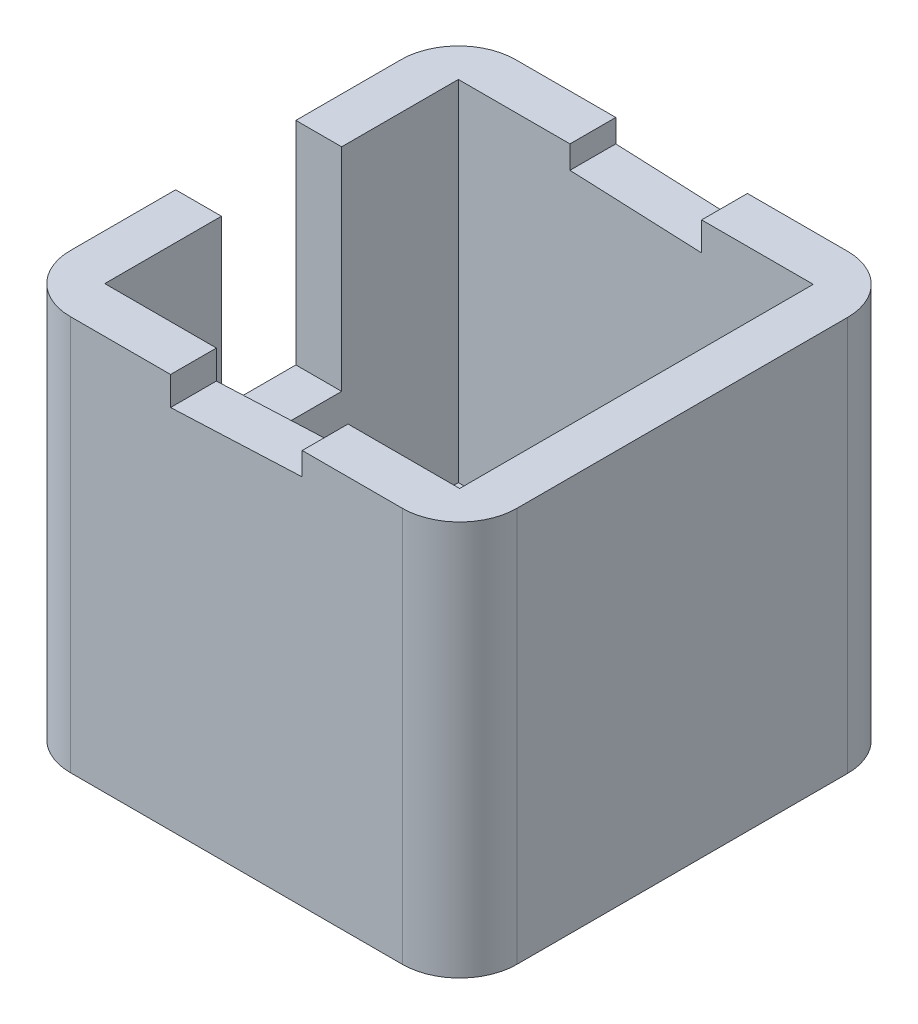
ISO-10303-21;
HEADER;
FILE_DESCRIPTION(('STEP AP214'),'2;1');
FILE_NAME('part.step','',(''),(''),'','','');
FILE_SCHEMA(('AUTOMOTIVE_DESIGN { 1 0 10303 214 1 1 1 1 }'));
ENDSEC;
DATA;
#1=APPLICATION_CONTEXT('core data for automotive mechanical design processes');
#2=APPLICATION_PROTOCOL_DEFINITION('international standard','automotive_design',2000,#1);
#3=PRODUCT_CONTEXT('',#1,'mechanical');
#4=PRODUCT('Part','Part','',(#3));
#5=PRODUCT_RELATED_PRODUCT_CATEGORY('part','',(#4));
#6=PRODUCT_DEFINITION_FORMATION('','',#4);
#7=PRODUCT_DEFINITION_CONTEXT('part definition',#1,'design');
#8=PRODUCT_DEFINITION('design','',#6,#7);
#9=PRODUCT_DEFINITION_SHAPE('','',#8);
#10=(LENGTH_UNIT() NAMED_UNIT(*) SI_UNIT(.MILLI.,.METRE.));
#11=(NAMED_UNIT(*) PLANE_ANGLE_UNIT() SI_UNIT($,.RADIAN.));
#12=(NAMED_UNIT(*) SI_UNIT($,.STERADIAN.) SOLID_ANGLE_UNIT());
#13=UNCERTAINTY_MEASURE_WITH_UNIT(LENGTH_MEASURE(1.E-05),#10,'distance_accuracy_value','');
#14=(GEOMETRIC_REPRESENTATION_CONTEXT(3) GLOBAL_UNCERTAINTY_ASSIGNED_CONTEXT((#13)) GLOBAL_UNIT_ASSIGNED_CONTEXT((#10,
#11,#12)) REPRESENTATION_CONTEXT('',''));
#15=CARTESIAN_POINT('',(0.,0.,0.));
#16=DIRECTION('',(0.,0.,1.));
#17=DIRECTION('',(1.,0.,0.));
#18=AXIS2_PLACEMENT_3D('',#15,#16,#17);
#19=CARTESIAN_POINT('',(0.,69.,0.));
#20=DIRECTION('',(0.,1.,0.));
#21=DIRECTION('',(0.,0.,1.));
#22=AXIS2_PLACEMENT_3D('',#19,#20,#21);
#23=PLANE('',#22);
#24=DIRECTION('',(-1.,0.,0.));
#25=VECTOR('',#24,1.);
#26=CARTESIAN_POINT('',(2.00000000000001,69.,-20.3852522355587));
#27=LINE('',#26,#25);
#28=CARTESIAN_POINT('',(0.,69.,-20.3852522355587));
#29=VERTEX_POINT('',#28);
#30=CARTESIAN_POINT('',(-7.99999999999999,69.,-20.3852522355587));
#31=VERTEX_POINT('',#30);
#32=EDGE_CURVE('E363',#29,#31,#27,.T.);
#33=ORIENTED_EDGE('',*,*,#32,.T.);
#34=DIRECTION('',(0.,0.,-1.));
#35=VECTOR('',#34,1.);
#36=CARTESIAN_POINT('',(-8.,69.,8.));
#37=LINE('',#36,#35);
#38=CARTESIAN_POINT('',(-8.,69.,-2.));
#39=VERTEX_POINT('',#38);
#40=EDGE_CURVE('E272',#39,#31,#37,.T.);
#41=ORIENTED_EDGE('',*,*,#40,.F.);
#42=CARTESIAN_POINT('',(2.,69.,-2.));
#43=DIRECTION('',(0.,1.,0.));
#44=DIRECTION('',(0.,0.,1.));
#45=AXIS2_PLACEMENT_3D('',#42,#43,#44);
#46=CIRCLE('',#45,10.);
#47=CARTESIAN_POINT('',(2.,69.,8.));
#48=VERTEX_POINT('',#47);
#49=EDGE_CURVE('E337',#39,#48,#46,.T.);
#50=ORIENTED_EDGE('',*,*,#49,.T.);
#51=DIRECTION('',(1.,0.,0.));
#52=VECTOR('',#51,1.);
#53=CARTESIAN_POINT('',(-8.,69.,8.));
#54=LINE('',#53,#52);
#55=CARTESIAN_POINT('',(19.5,69.,8.));
#56=VERTEX_POINT('',#55);
#57=EDGE_CURVE('E481',#48,#56,#54,.T.);
#58=ORIENTED_EDGE('',*,*,#57,.T.);
#59=DIRECTION('',(0.,0.,1.));
#60=VECTOR('',#59,1.);
#61=CARTESIAN_POINT('',(19.5,69.,0.));
#62=LINE('',#61,#60);
#63=CARTESIAN_POINT('',(19.5,69.,0.));
#64=VERTEX_POINT('',#63);
#65=EDGE_CURVE('E379',#64,#56,#62,.T.);
#66=ORIENTED_EDGE('',*,*,#65,.F.);
#67=DIRECTION('',(1.,0.,0.));
#68=VECTOR('',#67,1.);
#69=CARTESIAN_POINT('',(0.,69.,0.));
#70=LINE('',#69,#68);
#71=CARTESIAN_POINT('',(0.,69.,0.));
#72=VERTEX_POINT('',#71);
#73=EDGE_CURVE('E467',#72,#64,#70,.T.);
#74=ORIENTED_EDGE('',*,*,#73,.F.);
#75=DIRECTION('',(0.,0.,-1.));
#76=VECTOR('',#75,1.);
#77=CARTESIAN_POINT('',(0.,69.,0.));
#78=LINE('',#77,#76);
#79=EDGE_CURVE('E457',#72,#29,#78,.T.);
#80=ORIENTED_EDGE('',*,*,#79,.T.);
#81=EDGE_LOOP('',(#33,#41,#50,#58,#66,#74,#80));
#82=FACE_BOUND('',#81,.T.);
#83=ADVANCED_FACE('F87',(#82),#23,.T.);
#84=DIRECTION('',(0.,0.,1.));
#85=VECTOR('',#84,1.);
#86=CARTESIAN_POINT('',(42.5,69.,0.));
#87=LINE('',#86,#85);
#88=CARTESIAN_POINT('',(42.5,69.,0.));
#89=VERTEX_POINT('',#88);
#90=CARTESIAN_POINT('',(42.5,69.,8.));
#91=VERTEX_POINT('',#90);
#92=EDGE_CURVE('E386',#89,#91,#87,.T.);
#93=ORIENTED_EDGE('',*,*,#92,.T.);
#94=CARTESIAN_POINT('',(60.,69.,8.));
#95=VERTEX_POINT('',#94);
#96=EDGE_CURVE('E295',#91,#95,#54,.T.);
#97=ORIENTED_EDGE('',*,*,#96,.T.);
#98=CARTESIAN_POINT('',(60.,69.,-2.));
#99=DIRECTION('',(0.,1.,0.));
#100=DIRECTION('',(0.,0.,1.));
#101=AXIS2_PLACEMENT_3D('',#98,#99,#100);
#102=CIRCLE('',#101,10.);
#103=CARTESIAN_POINT('',(70.,69.,-2.));
#104=VERTEX_POINT('',#103);
#105=EDGE_CURVE('E335',#95,#104,#102,.T.);
#106=ORIENTED_EDGE('',*,*,#105,.T.);
#107=DIRECTION('',(0.,0.,-1.));
#108=VECTOR('',#107,1.);
#109=CARTESIAN_POINT('',(70.,69.,8.));
#110=LINE('',#109,#108);
#111=CARTESIAN_POINT('',(70.,69.,-59.7705044711174));
#112=VERTEX_POINT('',#111);
#113=EDGE_CURVE('E483',#104,#112,#110,.T.);
#114=ORIENTED_EDGE('',*,*,#113,.T.);
#115=CARTESIAN_POINT('',(60.,69.,-59.7705044711174));
#116=DIRECTION('',(0.,1.,0.));
#117=DIRECTION('',(0.,0.,1.));
#118=AXIS2_PLACEMENT_3D('',#115,#116,#117);
#119=CIRCLE('',#118,10.);
#120=CARTESIAN_POINT('',(60.,69.,-69.7705044711174));
#121=VERTEX_POINT('',#120);
#122=EDGE_CURVE('E340',#112,#121,#119,.T.);
#123=ORIENTED_EDGE('',*,*,#122,.T.);
#124=DIRECTION('',(1.,0.,0.));
#125=VECTOR('',#124,1.);
#126=CARTESIAN_POINT('',(-7.99999999999998,69.,-69.7705044711174));
#127=LINE('',#126,#125);
#128=CARTESIAN_POINT('',(42.5,69.,-69.7705044711174));
#129=VERTEX_POINT('',#128);
#130=EDGE_CURVE('E278',#129,#121,#127,.T.);
#131=ORIENTED_EDGE('',*,*,#130,.F.);
#132=DIRECTION('',(0.,0.,-1.));
#133=VECTOR('',#132,1.);
#134=CARTESIAN_POINT('',(42.5,69.,-61.7705044711174));
#135=LINE('',#134,#133);
#136=CARTESIAN_POINT('',(42.5,69.,-61.7705044711174));
#137=VERTEX_POINT('',#136);
#138=EDGE_CURVE('E405',#137,#129,#135,.T.);
#139=ORIENTED_EDGE('',*,*,#138,.F.);
#140=DIRECTION('',(1.,0.,0.));
#141=VECTOR('',#140,1.);
#142=CARTESIAN_POINT('',(0.,69.,-61.7705044711174));
#143=LINE('',#142,#141);
#144=CARTESIAN_POINT('',(62.,69.,-61.7705044711174));
#145=VERTEX_POINT('',#144);
#146=EDGE_CURVE('E459',#137,#145,#143,.T.);
#147=ORIENTED_EDGE('',*,*,#146,.T.);
#148=DIRECTION('',(0.,0.,-1.));
#149=VECTOR('',#148,1.);
#150=CARTESIAN_POINT('',(62.,69.,0.));
#151=LINE('',#150,#149);
#152=CARTESIAN_POINT('',(62.,69.,0.));
#153=VERTEX_POINT('',#152);
#154=EDGE_CURVE('E463',#153,#145,#151,.T.);
#155=ORIENTED_EDGE('',*,*,#154,.F.);
#156=EDGE_CURVE('E466',#89,#153,#70,.T.);
#157=ORIENTED_EDGE('',*,*,#156,.F.);
#158=EDGE_LOOP('',(#93,#97,#106,#114,#123,#131,#139,#147,#155,#157));
#159=FACE_BOUND('',#158,.T.);
#160=ADVANCED_FACE('F497',(#159),#23,.T.);
#161=CARTESIAN_POINT('',(56.3431457505076,56.,-56.1136502216251));
#162=DIRECTION('',(0.,-1.,0.));
#163=DIRECTION('',(0.,0.,-1.));
#164=AXIS2_PLACEMENT_3D('',#161,#162,#163);
#165=CYLINDRICAL_SURFACE('',#164,4.);
#166=CARTESIAN_POINT('',(56.3431457505076,8.,-56.1136502216251));
#167=DIRECTION('',(0.,1.,0.));
#168=DIRECTION('',(0.,0.,1.));
#169=AXIS2_PLACEMENT_3D('',#166,#167,#168);
#170=CIRCLE('',#169,4.);
#171=CARTESIAN_POINT('',(56.3431457505076,8.,-52.1136502216251));
#172=VERTEX_POINT('',#171);
#173=EDGE_CURVE('E450',#172,#172,#170,.T.);
#174=ORIENTED_EDGE('',*,*,#173,.T.);
#175=EDGE_LOOP('',(#174));
#176=FACE_BOUND('',#175,.T.);
#177=CARTESIAN_POINT('',(56.3431457505076,4.,-56.1136502216251));
#178=DIRECTION('',(0.,-1.,0.));
#179=DIRECTION('',(0.,0.,-1.));
#180=AXIS2_PLACEMENT_3D('',#177,#178,#179);
#181=CIRCLE('',#180,4.);
#182=CARTESIAN_POINT('',(56.3431457505076,4.,-60.1136502216251));
#183=VERTEX_POINT('',#182);
#184=EDGE_CURVE('E314',#183,#183,#181,.F.);
#185=ORIENTED_EDGE('',*,*,#184,.F.);
#186=EDGE_LOOP('',(#185));
#187=FACE_BOUND('',#186,.T.);
#188=ADVANCED_FACE('F575',(#176,#187),#165,.F.);
#189=CARTESIAN_POINT('',(5.65685424949236,56.,-5.65685424949237));
#190=DIRECTION('',(0.,-1.,0.));
#191=DIRECTION('',(0.,0.,-1.));
#192=AXIS2_PLACEMENT_3D('',#189,#190,#191);
#193=CYLINDRICAL_SURFACE('',#192,4.);
#194=CARTESIAN_POINT('',(5.65685424949236,8.,-5.65685424949237));
#195=DIRECTION('',(0.,1.,0.));
#196=DIRECTION('',(0.,0.,1.));
#197=AXIS2_PLACEMENT_3D('',#194,#195,#196);
#198=CIRCLE('',#197,4.);
#199=CARTESIAN_POINT('',(5.65685424949236,8.,-1.65685424949236));
#200=VERTEX_POINT('',#199);
#201=EDGE_CURVE('E442',#200,#200,#198,.T.);
#202=ORIENTED_EDGE('',*,*,#201,.T.);
#203=EDGE_LOOP('',(#202));
#204=FACE_BOUND('',#203,.T.);
#205=CARTESIAN_POINT('',(5.65685424949236,4.,-5.65685424949237));
#206=DIRECTION('',(0.,-1.,0.));
#207=DIRECTION('',(0.,0.,-1.));
#208=AXIS2_PLACEMENT_3D('',#205,#206,#207);
#209=CIRCLE('',#208,4.);
#210=CARTESIAN_POINT('',(5.65685424949236,4.,-9.65685424949237));
#211=VERTEX_POINT('',#210);
#212=EDGE_CURVE('E308',#211,#211,#209,.F.);
#213=ORIENTED_EDGE('',*,*,#212,.F.);
#214=EDGE_LOOP('',(#213));
#215=FACE_BOUND('',#214,.T.);
#216=ADVANCED_FACE('F595',(#204,#215),#193,.F.);
#217=CARTESIAN_POINT('',(0.,8.,0.));
#218=DIRECTION('',(0.,1.,0.));
#219=DIRECTION('',(0.,0.,1.));
#220=AXIS2_PLACEMENT_3D('',#217,#218,#219);
#221=PLANE('',#220);
#222=CARTESIAN_POINT('',(56.3431457505076,8.,-5.65685424949237));
#223=DIRECTION('',(0.,1.,0.));
#224=DIRECTION('',(0.,0.,1.));
#225=AXIS2_PLACEMENT_3D('',#222,#223,#224);
#226=CIRCLE('',#225,4.);
#227=CARTESIAN_POINT('',(56.3431457505076,8.,-1.65685424949237));
#228=VERTEX_POINT('',#227);
#229=EDGE_CURVE('E447',#228,#228,#226,.F.);
#230=ORIENTED_EDGE('',*,*,#229,.T.);
#231=EDGE_LOOP('',(#230));
#232=FACE_BOUND('',#231,.T.);
#233=ORIENTED_EDGE('',*,*,#201,.F.);
#234=EDGE_LOOP('',(#233));
#235=FACE_BOUND('',#234,.T.);
#236=DIRECTION('',(1.,0.,0.));
#237=VECTOR('',#236,1.);
#238=CARTESIAN_POINT('',(0.,8.,0.));
#239=LINE('',#238,#237);
#240=CARTESIAN_POINT('',(0.,8.,0.));
#241=VERTEX_POINT('',#240);
#242=CARTESIAN_POINT('',(62.,8.,0.));
#243=VERTEX_POINT('',#242);
#244=EDGE_CURVE('E276',#241,#243,#239,.T.);
#245=ORIENTED_EDGE('',*,*,#244,.T.);
#246=DIRECTION('',(0.,0.,-1.));
#247=VECTOR('',#246,1.);
#248=CARTESIAN_POINT('',(62.,8.,0.));
#249=LINE('',#248,#247);
#250=CARTESIAN_POINT('',(62.,8.,-61.7705044711174));
#251=VERTEX_POINT('',#250);
#252=EDGE_CURVE('E297',#243,#251,#249,.T.);
#253=ORIENTED_EDGE('',*,*,#252,.T.);
#254=DIRECTION('',(1.,0.,0.));
#255=VECTOR('',#254,1.);
#256=CARTESIAN_POINT('',(0.,8.,-61.7705044711174));
#257=LINE('',#256,#255);
#258=CARTESIAN_POINT('',(0.,8.,-61.7705044711174));
#259=VERTEX_POINT('',#258);
#260=EDGE_CURVE('E299',#259,#251,#257,.T.);
#261=ORIENTED_EDGE('',*,*,#260,.F.);
#262=DIRECTION('',(0.,0.,-1.));
#263=VECTOR('',#262,1.);
#264=CARTESIAN_POINT('',(0.,8.,0.));
#265=LINE('',#264,#263);
#266=EDGE_CURVE('E302',#241,#259,#265,.T.);
#267=ORIENTED_EDGE('',*,*,#266,.F.);
#268=EDGE_LOOP('',(#245,#253,#261,#267));
#269=FACE_BOUND('',#268,.T.);
#270=ORIENTED_EDGE('',*,*,#173,.F.);
#271=EDGE_LOOP('',(#270));
#272=FACE_BOUND('',#271,.T.);
#273=CARTESIAN_POINT('',(5.65685424949236,8.,-56.1136502216251));
#274=DIRECTION('',(0.,1.,0.));
#275=DIRECTION('',(0.,0.,1.));
#276=AXIS2_PLACEMENT_3D('',#273,#274,#275);
#277=CIRCLE('',#276,4.);
#278=CARTESIAN_POINT('',(5.65685424949236,8.,-52.1136502216251));
#279=VERTEX_POINT('',#278);
#280=EDGE_CURVE('E453',#279,#279,#277,.F.);
#281=ORIENTED_EDGE('',*,*,#280,.T.);
#282=EDGE_LOOP('',(#281));
#283=FACE_BOUND('',#282,.T.);
#284=ADVANCED_FACE('F592',(#232,#235,#269,#272,#283),#221,.T.);
#285=CARTESIAN_POINT('',(0.,0.,0.));
#286=DIRECTION('',(0.,1.,0.));
#287=DIRECTION('',(0.,0.,1.));
#288=AXIS2_PLACEMENT_3D('',#285,#286,#287);
#289=PLANE('',#288);
#290=DIRECTION('',(1.,0.,0.));
#291=VECTOR('',#290,1.);
#292=CARTESIAN_POINT('',(-7.99999999999998,0.,-69.7705044711174));
#293=LINE('',#292,#291);
#294=CARTESIAN_POINT('',(2.00000000000002,0.,-69.7705044711174));
#295=VERTEX_POINT('',#294);
#296=CARTESIAN_POINT('',(60.,0.,-69.7705044711174));
#297=VERTEX_POINT('',#296);
#298=EDGE_CURVE('E289',#295,#297,#293,.T.);
#299=ORIENTED_EDGE('',*,*,#298,.T.);
#300=CARTESIAN_POINT('',(60.,0.,-59.7705044711174));
#301=DIRECTION('',(0.,1.,0.));
#302=DIRECTION('',(0.,0.,1.));
#303=AXIS2_PLACEMENT_3D('',#300,#301,#302);
#304=CIRCLE('',#303,10.);
#305=CARTESIAN_POINT('',(70.,0.,-59.7705044711174));
#306=VERTEX_POINT('',#305);
#307=EDGE_CURVE('E328',#297,#306,#304,.F.);
#308=ORIENTED_EDGE('',*,*,#307,.T.);
#309=DIRECTION('',(0.,0.,-1.));
#310=VECTOR('',#309,1.);
#311=CARTESIAN_POINT('',(70.,0.,8.));
#312=LINE('',#311,#310);
#313=CARTESIAN_POINT('',(70.,0.,-2.));
#314=VERTEX_POINT('',#313);
#315=EDGE_CURVE('E285',#314,#306,#312,.T.);
#316=ORIENTED_EDGE('',*,*,#315,.F.);
#317=CARTESIAN_POINT('',(60.,0.,-2.));
#318=DIRECTION('',(0.,1.,0.));
#319=DIRECTION('',(0.,0.,1.));
#320=AXIS2_PLACEMENT_3D('',#317,#318,#319);
#321=CIRCLE('',#320,10.);
#322=CARTESIAN_POINT('',(60.,0.,8.));
#323=VERTEX_POINT('',#322);
#324=EDGE_CURVE('E322',#314,#323,#321,.F.);
#325=ORIENTED_EDGE('',*,*,#324,.T.);
#326=DIRECTION('',(1.,0.,0.));
#327=VECTOR('',#326,1.);
#328=CARTESIAN_POINT('',(-8.,0.,8.));
#329=LINE('',#328,#327);
#330=CARTESIAN_POINT('',(2.,0.,8.));
#331=VERTEX_POINT('',#330);
#332=EDGE_CURVE('E282',#331,#323,#329,.T.);
#333=ORIENTED_EDGE('',*,*,#332,.F.);
#334=CARTESIAN_POINT('',(2.,0.,-2.));
#335=DIRECTION('',(0.,1.,0.));
#336=DIRECTION('',(0.,0.,1.));
#337=AXIS2_PLACEMENT_3D('',#334,#335,#336);
#338=CIRCLE('',#337,10.);
#339=CARTESIAN_POINT('',(-8.,0.,-2.));
#340=VERTEX_POINT('',#339);
#341=EDGE_CURVE('E324',#331,#340,#338,.F.);
#342=ORIENTED_EDGE('',*,*,#341,.T.);
#343=DIRECTION('',(0.,0.,-1.));
#344=VECTOR('',#343,1.);
#345=CARTESIAN_POINT('',(-8.,0.,8.));
#346=LINE('',#345,#344);
#347=CARTESIAN_POINT('',(-7.99999999999998,0.,-59.7705044711174));
#348=VERTEX_POINT('',#347);
#349=EDGE_CURVE('E292',#340,#348,#346,.T.);
#350=ORIENTED_EDGE('',*,*,#349,.T.);
#351=CARTESIAN_POINT('',(2.00000000000002,0.,-59.7705044711174));
#352=DIRECTION('',(0.,1.,0.));
#353=DIRECTION('',(0.,0.,1.));
#354=AXIS2_PLACEMENT_3D('',#351,#352,#353);
#355=CIRCLE('',#354,10.);
#356=EDGE_CURVE('E326',#348,#295,#355,.F.);
#357=ORIENTED_EDGE('',*,*,#356,.T.);
#358=EDGE_LOOP('',(#299,#308,#316,#325,#333,#342,#350,#357));
#359=FACE_BOUND('',#358,.T.);
#360=CARTESIAN_POINT('',(56.3431457505076,0.,-5.65685424949237));
#361=DIRECTION('',(0.,1.,0.));
#362=DIRECTION('',(0.,0.,1.));
#363=AXIS2_PLACEMENT_3D('',#360,#361,#362);
#364=CIRCLE('',#363,2.);
#365=CARTESIAN_POINT('',(56.3431457505076,0.,-3.65685424949237));
#366=VERTEX_POINT('',#365);
#367=EDGE_CURVE('E436',#366,#366,#364,.T.);
#368=ORIENTED_EDGE('',*,*,#367,.T.);
#369=EDGE_LOOP('',(#368));
#370=FACE_BOUND('',#369,.T.);
#371=CARTESIAN_POINT('',(5.65685424949236,0.,-5.65685424949237));
#372=DIRECTION('',(0.,-1.,0.));
#373=DIRECTION('',(0.,0.,-1.));
#374=AXIS2_PLACEMENT_3D('',#371,#372,#373);
#375=CIRCLE('',#374,2.);
#376=CARTESIAN_POINT('',(5.65685424949236,0.,-7.65685424949237));
#377=VERTEX_POINT('',#376);
#378=EDGE_CURVE('E433',#377,#377,#375,.T.);
#379=ORIENTED_EDGE('',*,*,#378,.F.);
#380=EDGE_LOOP('',(#379));
#381=FACE_BOUND('',#380,.T.);
#382=CARTESIAN_POINT('',(5.65685424949236,0.,-56.1136502216251));
#383=DIRECTION('',(0.,1.,0.));
#384=DIRECTION('',(0.,0.,1.));
#385=AXIS2_PLACEMENT_3D('',#382,#383,#384);
#386=CIRCLE('',#385,2.);
#387=CARTESIAN_POINT('',(5.65685424949236,0.,-54.1136502216251));
#388=VERTEX_POINT('',#387);
#389=EDGE_CURVE('E427',#388,#388,#386,.T.);
#390=ORIENTED_EDGE('',*,*,#389,.T.);
#391=EDGE_LOOP('',(#390));
#392=FACE_BOUND('',#391,.T.);
#393=CARTESIAN_POINT('',(56.3431457505076,0.,-56.1136502216251));
#394=DIRECTION('',(0.,-1.,0.));
#395=DIRECTION('',(0.,0.,-1.));
#396=AXIS2_PLACEMENT_3D('',#393,#394,#395);
#397=CIRCLE('',#396,2.);
#398=CARTESIAN_POINT('',(56.3431457505076,0.,-58.1136502216251));
#399=VERTEX_POINT('',#398);
#400=EDGE_CURVE('E421',#399,#399,#397,.T.);
#401=ORIENTED_EDGE('',*,*,#400,.F.);
#402=EDGE_LOOP('',(#401));
#403=FACE_BOUND('',#402,.T.);
#404=ADVANCED_FACE('F503',(#359,#370,#381,#392,#403),#289,.F.);
#405=CARTESIAN_POINT('',(-8.,69.,8.));
#406=DIRECTION('',(0.,0.,-1.));
#407=DIRECTION('',(-1.,0.,0.));
#408=AXIS2_PLACEMENT_3D('',#405,#406,#407);
#409=PLANE('',#408);
#410=ORIENTED_EDGE('',*,*,#96,.F.);
#411=DIRECTION('',(0.,1.,0.));
#412=VECTOR('',#411,1.);
#413=CARTESIAN_POINT('',(42.5,65.,8.));
#414=LINE('',#413,#412);
#415=CARTESIAN_POINT('',(42.5,65.,8.));
#416=VERTEX_POINT('',#415);
#417=EDGE_CURVE('E374',#416,#91,#414,.T.);
#418=ORIENTED_EDGE('',*,*,#417,.F.);
#419=DIRECTION('',(0.999056158355059,0.043437224276307,0.));
#420=VECTOR('',#419,1.);
#421=CARTESIAN_POINT('',(19.5,64.,8.));
#422=LINE('',#421,#420);
#423=CARTESIAN_POINT('',(19.5,64.,8.));
#424=VERTEX_POINT('',#423);
#425=EDGE_CURVE('E382',#424,#416,#422,.T.);
#426=ORIENTED_EDGE('',*,*,#425,.F.);
#427=DIRECTION('',(0.,-1.,0.));
#428=VECTOR('',#427,1.);
#429=CARTESIAN_POINT('',(19.5,69.,8.));
#430=LINE('',#429,#428);
#431=EDGE_CURVE('E366',#56,#424,#430,.T.);
#432=ORIENTED_EDGE('',*,*,#431,.F.);
#433=ORIENTED_EDGE('',*,*,#57,.F.);
#434=DIRECTION('',(0.,-1.,0.));
#435=VECTOR('',#434,1.);
#436=CARTESIAN_POINT('',(2.,0.,8.));
#437=LINE('',#436,#435);
#438=EDGE_CURVE('E350',#48,#331,#437,.T.);
#439=ORIENTED_EDGE('',*,*,#438,.T.);
#440=ORIENTED_EDGE('',*,*,#332,.T.);
#441=DIRECTION('',(0.,-1.,0.));
#442=VECTOR('',#441,1.);
#443=CARTESIAN_POINT('',(60.,69.,8.));
#444=LINE('',#443,#442);
#445=EDGE_CURVE('E347',#323,#95,#444,.F.);
#446=ORIENTED_EDGE('',*,*,#445,.T.);
#447=EDGE_LOOP('',(#410,#418,#426,#432,#433,#439,#440,#446));
#448=FACE_BOUND('',#447,.T.);
#449=ADVANCED_FACE('F514',(#448),#409,.F.);
#450=CARTESIAN_POINT('',(70.,69.,8.));
#451=DIRECTION('',(-1.,0.,0.));
#452=DIRECTION('',(0.,0.,1.));
#453=AXIS2_PLACEMENT_3D('',#450,#451,#452);
#454=PLANE('',#453);
#455=ORIENTED_EDGE('',*,*,#315,.T.);
#456=DIRECTION('',(0.,-1.,0.));
#457=VECTOR('',#456,1.);
#458=CARTESIAN_POINT('',(70.,69.,-59.7705044711174));
#459=LINE('',#458,#457);
#460=EDGE_CURVE('E333',#306,#112,#459,.F.);
#461=ORIENTED_EDGE('',*,*,#460,.T.);
#462=ORIENTED_EDGE('',*,*,#113,.F.);
#463=DIRECTION('',(0.,-1.,0.));
#464=VECTOR('',#463,1.);
#465=CARTESIAN_POINT('',(70.,69.,-2.));
#466=LINE('',#465,#464);
#467=EDGE_CURVE('E330',#104,#314,#466,.T.);
#468=ORIENTED_EDGE('',*,*,#467,.T.);
#469=EDGE_LOOP('',(#455,#461,#462,#468));
#470=FACE_BOUND('',#469,.T.);
#471=ADVANCED_FACE('F506',(#470),#454,.F.);
#472=CARTESIAN_POINT('',(-7.99999999999998,69.,-69.7705044711174));
#473=DIRECTION('',(0.,0.,-1.));
#474=DIRECTION('',(-1.,0.,0.));
#475=AXIS2_PLACEMENT_3D('',#472,#473,#474);
#476=PLANE('',#475);
#477=DIRECTION('',(0.,1.,0.));
#478=VECTOR('',#477,1.);
#479=CARTESIAN_POINT('',(19.5,65.,-69.7705044711174));
#480=LINE('',#479,#478);
#481=CARTESIAN_POINT('',(19.5,65.,-69.7705044711174));
#482=VERTEX_POINT('',#481);
#483=CARTESIAN_POINT('',(19.5,69.,-69.7705044711174));
#484=VERTEX_POINT('',#483);
#485=EDGE_CURVE('E399',#482,#484,#480,.T.);
#486=ORIENTED_EDGE('',*,*,#485,.F.);
#487=DIRECTION('',(-0.999056158355059,0.043437224276307,0.));
#488=VECTOR('',#487,1.);
#489=CARTESIAN_POINT('',(42.5,64.,-69.7705044711174));
#490=LINE('',#489,#488);
#491=CARTESIAN_POINT('',(42.5,64.,-69.7705044711174));
#492=VERTEX_POINT('',#491);
#493=EDGE_CURVE('E408',#492,#482,#490,.T.);
#494=ORIENTED_EDGE('',*,*,#493,.F.);
#495=DIRECTION('',(0.,-1.,0.));
#496=VECTOR('',#495,1.);
#497=CARTESIAN_POINT('',(42.5,69.,-69.7705044711174));
#498=LINE('',#497,#496);
#499=EDGE_CURVE('E389',#129,#492,#498,.T.);
#500=ORIENTED_EDGE('',*,*,#499,.F.);
#501=ORIENTED_EDGE('',*,*,#130,.T.);
#502=DIRECTION('',(0.,-1.,0.));
#503=VECTOR('',#502,1.);
#504=CARTESIAN_POINT('',(60.,0.,-69.7705044711174));
#505=LINE('',#504,#503);
#506=EDGE_CURVE('E319',#121,#297,#505,.T.);
#507=ORIENTED_EDGE('',*,*,#506,.T.);
#508=ORIENTED_EDGE('',*,*,#298,.F.);
#509=DIRECTION('',(0.,-1.,0.));
#510=VECTOR('',#509,1.);
#511=CARTESIAN_POINT('',(2.00000000000002,69.,-69.7705044711174));
#512=LINE('',#511,#510);
#513=CARTESIAN_POINT('',(2.00000000000002,69.,-69.7705044711174));
#514=VERTEX_POINT('',#513);
#515=EDGE_CURVE('E317',#295,#514,#512,.F.);
#516=ORIENTED_EDGE('',*,*,#515,.T.);
#517=EDGE_CURVE('E273',#514,#484,#127,.T.);
#518=ORIENTED_EDGE('',*,*,#517,.T.);
#519=EDGE_LOOP('',(#486,#494,#500,#501,#507,#508,#516,#518));
#520=FACE_BOUND('',#519,.T.);
#521=ADVANCED_FACE('F492',(#520),#476,.T.);
#522=CARTESIAN_POINT('',(-8.,69.,8.));
#523=DIRECTION('',(-1.,0.,0.));
#524=DIRECTION('',(0.,0.,1.));
#525=AXIS2_PLACEMENT_3D('',#522,#523,#524);
#526=PLANE('',#525);
#527=DIRECTION('',(0.,1.,0.));
#528=VECTOR('',#527,1.);
#529=CARTESIAN_POINT('',(-7.99999999999999,32.,-20.3852522355587));
#530=LINE('',#529,#528);
#531=CARTESIAN_POINT('',(-7.99999999999999,32.,-20.3852522355587));
#532=VERTEX_POINT('',#531);
#533=EDGE_CURVE('E256',#532,#31,#530,.T.);
#534=ORIENTED_EDGE('',*,*,#533,.F.);
#535=DIRECTION('',(0.,0.,1.));
#536=VECTOR('',#535,1.);
#537=CARTESIAN_POINT('',(-7.99999999999999,32.,-41.3852522355587));
#538=LINE('',#537,#536);
#539=CARTESIAN_POINT('',(-7.99999999999999,32.,-41.3852522355587));
#540=VERTEX_POINT('',#539);
#541=EDGE_CURVE('E265',#540,#532,#538,.T.);
#542=ORIENTED_EDGE('',*,*,#541,.F.);
#543=DIRECTION('',(0.,-1.,0.));
#544=VECTOR('',#543,1.);
#545=CARTESIAN_POINT('',(-7.99999999999999,69.,-41.3852522355587));
#546=LINE('',#545,#544);
#547=CARTESIAN_POINT('',(-7.99999999999999,69.,-41.3852522355587));
#548=VERTEX_POINT('',#547);
#549=EDGE_CURVE('E249',#548,#540,#546,.T.);
#550=ORIENTED_EDGE('',*,*,#549,.F.);
#551=CARTESIAN_POINT('',(-7.99999999999998,69.,-59.7705044711174));
#552=VERTEX_POINT('',#551);
#553=EDGE_CURVE('E262',#548,#552,#37,.T.);
#554=ORIENTED_EDGE('',*,*,#553,.T.);
#555=DIRECTION('',(0.,-1.,0.));
#556=VECTOR('',#555,1.);
#557=CARTESIAN_POINT('',(-7.99999999999998,69.,-59.7705044711174));
#558=LINE('',#557,#556);
#559=EDGE_CURVE('E345',#552,#348,#558,.T.);
#560=ORIENTED_EDGE('',*,*,#559,.T.);
#561=ORIENTED_EDGE('',*,*,#349,.F.);
#562=DIRECTION('',(0.,-1.,0.));
#563=VECTOR('',#562,1.);
#564=CARTESIAN_POINT('',(-8.,69.,-2.));
#565=LINE('',#564,#563);
#566=EDGE_CURVE('E343',#340,#39,#565,.F.);
#567=ORIENTED_EDGE('',*,*,#566,.T.);
#568=ORIENTED_EDGE('',*,*,#40,.T.);
#569=EDGE_LOOP('',(#534,#542,#550,#554,#560,#561,#567,#568));
#570=FACE_BOUND('',#569,.T.);
#571=ADVANCED_FACE('F260',(#570),#526,.T.);
#572=DIRECTION('',(-1.,0.,0.));
#573=VECTOR('',#572,1.);
#574=CARTESIAN_POINT('',(2.00000000000001,69.,-41.3852522355587));
#575=LINE('',#574,#573);
#576=CARTESIAN_POINT('',(0.,69.,-41.3852522355587));
#577=VERTEX_POINT('',#576);
#578=EDGE_CURVE('E246',#577,#548,#575,.T.);
#579=ORIENTED_EDGE('',*,*,#578,.F.);
#580=CARTESIAN_POINT('',(0.,69.,-61.7705044711174));
#581=VERTEX_POINT('',#580);
#582=EDGE_CURVE('E456',#577,#581,#78,.T.);
#583=ORIENTED_EDGE('',*,*,#582,.T.);
#584=CARTESIAN_POINT('',(19.5,69.,-61.7705044711174));
#585=VERTEX_POINT('',#584);
#586=EDGE_CURVE('E460',#581,#585,#143,.T.);
#587=ORIENTED_EDGE('',*,*,#586,.T.);
#588=DIRECTION('',(0.,0.,-1.));
#589=VECTOR('',#588,1.);
#590=CARTESIAN_POINT('',(19.5,69.,-61.7705044711174));
#591=LINE('',#590,#589);
#592=EDGE_CURVE('E412',#585,#484,#591,.T.);
#593=ORIENTED_EDGE('',*,*,#592,.T.);
#594=ORIENTED_EDGE('',*,*,#517,.F.);
#595=CARTESIAN_POINT('',(2.00000000000002,69.,-59.7705044711174));
#596=DIRECTION('',(0.,1.,0.));
#597=DIRECTION('',(0.,0.,1.));
#598=AXIS2_PLACEMENT_3D('',#595,#596,#597);
#599=CIRCLE('',#598,10.);
#600=EDGE_CURVE('E270',#514,#552,#599,.T.);
#601=ORIENTED_EDGE('',*,*,#600,.T.);
#602=ORIENTED_EDGE('',*,*,#553,.F.);
#603=EDGE_LOOP('',(#579,#583,#587,#593,#594,#601,#602));
#604=FACE_BOUND('',#603,.T.);
#605=ADVANCED_FACE('F267',(#604),#23,.T.);
#606=CARTESIAN_POINT('',(0.,69.,0.));
#607=DIRECTION('',(-1.,0.,0.));
#608=DIRECTION('',(0.,0.,1.));
#609=AXIS2_PLACEMENT_3D('',#606,#607,#608);
#610=PLANE('',#609);
#611=DIRECTION('',(0.,0.,1.));
#612=VECTOR('',#611,1.);
#613=CARTESIAN_POINT('',(0.,32.,0.));
#614=LINE('',#613,#612);
#615=CARTESIAN_POINT('',(0.,32.,-41.3852522355587));
#616=VERTEX_POINT('',#615);
#617=CARTESIAN_POINT('',(0.,32.,-20.3852522355587));
#618=VERTEX_POINT('',#617);
#619=EDGE_CURVE('E95',#616,#618,#614,.T.);
#620=ORIENTED_EDGE('',*,*,#619,.T.);
#621=DIRECTION('',(0.,1.,0.));
#622=VECTOR('',#621,1.);
#623=CARTESIAN_POINT('',(0.,69.,-20.3852522355587));
#624=LINE('',#623,#622);
#625=EDGE_CURVE('E12',#618,#29,#624,.T.);
#626=ORIENTED_EDGE('',*,*,#625,.T.);
#627=ORIENTED_EDGE('',*,*,#79,.F.);
#628=DIRECTION('',(0.,-1.,0.));
#629=VECTOR('',#628,1.);
#630=CARTESIAN_POINT('',(0.,69.,0.));
#631=LINE('',#630,#629);
#632=EDGE_CURVE('E286',#72,#241,#631,.T.);
#633=ORIENTED_EDGE('',*,*,#632,.T.);
#634=ORIENTED_EDGE('',*,*,#266,.T.);
#635=DIRECTION('',(0.,-1.,0.));
#636=VECTOR('',#635,1.);
#637=CARTESIAN_POINT('',(0.,69.,-61.7705044711174));
#638=LINE('',#637,#636);
#639=EDGE_CURVE('E470',#581,#259,#638,.T.);
#640=ORIENTED_EDGE('',*,*,#639,.F.);
#641=ORIENTED_EDGE('',*,*,#582,.F.);
#642=DIRECTION('',(0.,-1.,0.));
#643=VECTOR('',#642,1.);
#644=CARTESIAN_POINT('',(0.,69.,-41.3852522355587));
#645=LINE('',#644,#643);
#646=EDGE_CURVE('E252',#577,#616,#645,.T.);
#647=ORIENTED_EDGE('',*,*,#646,.T.);
#648=EDGE_LOOP('',(#620,#626,#627,#633,#634,#640,#641,#647));
#649=FACE_BOUND('',#648,.T.);
#650=ADVANCED_FACE('F355',(#649),#610,.F.);
#651=CARTESIAN_POINT('',(0.,69.,0.));
#652=DIRECTION('',(0.,0.,-1.));
#653=DIRECTION('',(-1.,0.,0.));
#654=AXIS2_PLACEMENT_3D('',#651,#652,#653);
#655=PLANE('',#654);
#656=DIRECTION('',(0.,1.,0.));
#657=VECTOR('',#656,1.);
#658=CARTESIAN_POINT('',(42.5,65.,0.));
#659=LINE('',#658,#657);
#660=CARTESIAN_POINT('',(42.5,65.,0.));
#661=VERTEX_POINT('',#660);
#662=EDGE_CURVE('E376',#661,#89,#659,.T.);
#663=ORIENTED_EDGE('',*,*,#662,.T.);
#664=ORIENTED_EDGE('',*,*,#156,.T.);
#665=DIRECTION('',(0.,-1.,0.));
#666=VECTOR('',#665,1.);
#667=CARTESIAN_POINT('',(62.,69.,0.));
#668=LINE('',#667,#666);
#669=EDGE_CURVE('E473',#153,#243,#668,.T.);
#670=ORIENTED_EDGE('',*,*,#669,.T.);
#671=ORIENTED_EDGE('',*,*,#244,.F.);
#672=ORIENTED_EDGE('',*,*,#632,.F.);
#673=ORIENTED_EDGE('',*,*,#73,.T.);
#674=DIRECTION('',(0.,-1.,0.));
#675=VECTOR('',#674,1.);
#676=CARTESIAN_POINT('',(19.5,69.,0.));
#677=LINE('',#676,#675);
#678=CARTESIAN_POINT('',(19.5,64.,0.));
#679=VERTEX_POINT('',#678);
#680=EDGE_CURVE('E371',#64,#679,#677,.T.);
#681=ORIENTED_EDGE('',*,*,#680,.T.);
#682=DIRECTION('',(0.999056158355059,0.043437224276307,0.));
#683=VECTOR('',#682,1.);
#684=CARTESIAN_POINT('',(19.5,64.,0.));
#685=LINE('',#684,#683);
#686=EDGE_CURVE('E110',#679,#661,#685,.T.);
#687=ORIENTED_EDGE('',*,*,#686,.T.);
#688=EDGE_LOOP('',(#663,#664,#670,#671,#672,#673,#681,#687));
#689=FACE_BOUND('',#688,.T.);
#690=ADVANCED_FACE('F547',(#689),#655,.T.);
#691=CARTESIAN_POINT('',(62.,69.,0.));
#692=DIRECTION('',(-1.,0.,0.));
#693=DIRECTION('',(0.,0.,1.));
#694=AXIS2_PLACEMENT_3D('',#691,#692,#693);
#695=PLANE('',#694);
#696=DIRECTION('',(0.,-1.,0.));
#697=VECTOR('',#696,1.);
#698=CARTESIAN_POINT('',(62.,69.,-61.7705044711174));
#699=LINE('',#698,#697);
#700=EDGE_CURVE('E476',#145,#251,#699,.T.);
#701=ORIENTED_EDGE('',*,*,#700,.T.);
#702=ORIENTED_EDGE('',*,*,#252,.F.);
#703=ORIENTED_EDGE('',*,*,#669,.F.);
#704=ORIENTED_EDGE('',*,*,#154,.T.);
#705=EDGE_LOOP('',(#701,#702,#703,#704));
#706=FACE_BOUND('',#705,.T.);
#707=ADVANCED_FACE('F544',(#706),#695,.T.);
#708=CARTESIAN_POINT('',(0.,69.,-61.7705044711174));
#709=DIRECTION('',(0.,0.,-1.));
#710=DIRECTION('',(-1.,0.,0.));
#711=AXIS2_PLACEMENT_3D('',#708,#709,#710);
#712=PLANE('',#711);
#713=DIRECTION('',(-0.999056158355059,0.043437224276307,0.));
#714=VECTOR('',#713,1.);
#715=CARTESIAN_POINT('',(42.5,64.,-61.7705044711174));
#716=LINE('',#715,#714);
#717=CARTESIAN_POINT('',(42.5,64.,-61.7705044711174));
#718=VERTEX_POINT('',#717);
#719=CARTESIAN_POINT('',(19.5,65.,-61.7705044711174));
#720=VERTEX_POINT('',#719);
#721=EDGE_CURVE('E398',#718,#720,#716,.T.);
#722=ORIENTED_EDGE('',*,*,#721,.T.);
#723=DIRECTION('',(0.,1.,0.));
#724=VECTOR('',#723,1.);
#725=CARTESIAN_POINT('',(19.5,65.,-61.7705044711174));
#726=LINE('',#725,#724);
#727=EDGE_CURVE('E402',#720,#585,#726,.T.);
#728=ORIENTED_EDGE('',*,*,#727,.T.);
#729=ORIENTED_EDGE('',*,*,#586,.F.);
#730=ORIENTED_EDGE('',*,*,#639,.T.);
#731=ORIENTED_EDGE('',*,*,#260,.T.);
#732=ORIENTED_EDGE('',*,*,#700,.F.);
#733=ORIENTED_EDGE('',*,*,#146,.F.);
#734=DIRECTION('',(0.,-1.,0.));
#735=VECTOR('',#734,1.);
#736=CARTESIAN_POINT('',(42.5,69.,-61.7705044711174));
#737=LINE('',#736,#735);
#738=EDGE_CURVE('E395',#137,#718,#737,.T.);
#739=ORIENTED_EDGE('',*,*,#738,.T.);
#740=EDGE_LOOP('',(#722,#728,#729,#730,#731,#732,#733,#739));
#741=FACE_BOUND('',#740,.T.);
#742=ADVANCED_FACE('F532',(#741),#712,.F.);
#743=CARTESIAN_POINT('',(56.3431457505076,56.,-5.65685424949237));
#744=DIRECTION('',(0.,-1.,0.));
#745=DIRECTION('',(0.,0.,-1.));
#746=AXIS2_PLACEMENT_3D('',#743,#744,#745);
#747=CYLINDRICAL_SURFACE('',#746,4.);
#748=CARTESIAN_POINT('',(56.3431457505076,4.,-5.65685424949237));
#749=DIRECTION('',(0.,1.,0.));
#750=DIRECTION('',(0.,0.,1.));
#751=AXIS2_PLACEMENT_3D('',#748,#749,#750);
#752=CIRCLE('',#751,4.);
#753=CARTESIAN_POINT('',(56.3431457505076,4.,-1.65685424949237));
#754=VERTEX_POINT('',#753);
#755=EDGE_CURVE('E305',#754,#754,#752,.T.);
#756=ORIENTED_EDGE('',*,*,#755,.F.);
#757=EDGE_LOOP('',(#756));
#758=FACE_BOUND('',#757,.T.);
#759=ORIENTED_EDGE('',*,*,#229,.F.);
#760=EDGE_LOOP('',(#759));
#761=FACE_BOUND('',#760,.T.);
#762=ADVANCED_FACE('F651',(#758,#761),#747,.F.);
#763=CARTESIAN_POINT('',(5.65685424949236,56.,-56.1136502216251));
#764=DIRECTION('',(0.,-1.,0.));
#765=DIRECTION('',(0.,0.,-1.));
#766=AXIS2_PLACEMENT_3D('',#763,#764,#765);
#767=CYLINDRICAL_SURFACE('',#766,4.);
#768=CARTESIAN_POINT('',(5.65685424949236,4.,-56.1136502216251));
#769=DIRECTION('',(0.,1.,0.));
#770=DIRECTION('',(0.,0.,1.));
#771=AXIS2_PLACEMENT_3D('',#768,#769,#770);
#772=CIRCLE('',#771,4.);
#773=CARTESIAN_POINT('',(5.65685424949236,4.,-52.1136502216251));
#774=VERTEX_POINT('',#773);
#775=EDGE_CURVE('E311',#774,#774,#772,.T.);
#776=ORIENTED_EDGE('',*,*,#775,.F.);
#777=EDGE_LOOP('',(#776));
#778=FACE_BOUND('',#777,.T.);
#779=ORIENTED_EDGE('',*,*,#280,.F.);
#780=EDGE_LOOP('',(#779));
#781=FACE_BOUND('',#780,.T.);
#782=ADVANCED_FACE('F649',(#778,#781),#767,.F.);
#783=CARTESIAN_POINT('',(56.3431457505076,4.,-5.65685424949237));
#784=DIRECTION('',(0.,1.,0.));
#785=DIRECTION('',(0.,0.,1.));
#786=AXIS2_PLACEMENT_3D('',#783,#784,#785);
#787=PLANE('',#786);
#788=ORIENTED_EDGE('',*,*,#755,.T.);
#789=EDGE_LOOP('',(#788));
#790=FACE_BOUND('',#789,.T.);
#791=CARTESIAN_POINT('',(56.3431457505076,4.,-5.65685424949237));
#792=DIRECTION('',(0.,1.,0.));
#793=DIRECTION('',(0.,0.,1.));
#794=AXIS2_PLACEMENT_3D('',#791,#792,#793);
#795=CIRCLE('',#794,2.);
#796=CARTESIAN_POINT('',(56.3431457505076,4.,-3.65685424949237));
#797=VERTEX_POINT('',#796);
#798=EDGE_CURVE('E439',#797,#797,#795,.T.);
#799=ORIENTED_EDGE('',*,*,#798,.F.);
#800=EDGE_LOOP('',(#799));
#801=FACE_BOUND('',#800,.T.);
#802=ADVANCED_FACE('F645',(#790,#801),#787,.T.);
#803=CARTESIAN_POINT('',(56.3431457505076,4.,-5.65685424949237));
#804=DIRECTION('',(0.,-1.,0.));
#805=DIRECTION('',(0.,0.,-1.));
#806=AXIS2_PLACEMENT_3D('',#803,#804,#805);
#807=CYLINDRICAL_SURFACE('',#806,2.);
#808=ORIENTED_EDGE('',*,*,#798,.T.);
#809=EDGE_LOOP('',(#808));
#810=FACE_BOUND('',#809,.T.);
#811=ORIENTED_EDGE('',*,*,#367,.F.);
#812=EDGE_LOOP('',(#811));
#813=FACE_BOUND('',#812,.T.);
#814=ADVANCED_FACE('F638',(#810,#813),#807,.F.);
#815=CARTESIAN_POINT('',(5.65685424949236,4.,-5.65685424949237));
#816=DIRECTION('',(0.,-1.,0.));
#817=DIRECTION('',(0.,0.,-1.));
#818=AXIS2_PLACEMENT_3D('',#815,#816,#817);
#819=PLANE('',#818);
#820=CARTESIAN_POINT('',(5.65685424949236,4.,-5.65685424949237));
#821=DIRECTION('',(0.,-1.,0.));
#822=DIRECTION('',(0.,0.,-1.));
#823=AXIS2_PLACEMENT_3D('',#820,#821,#822);
#824=CIRCLE('',#823,2.);
#825=CARTESIAN_POINT('',(5.65685424949236,4.,-7.65685424949237));
#826=VERTEX_POINT('',#825);
#827=EDGE_CURVE('E430',#826,#826,#824,.T.);
#828=ORIENTED_EDGE('',*,*,#827,.T.);
#829=EDGE_LOOP('',(#828));
#830=FACE_BOUND('',#829,.T.);
#831=ORIENTED_EDGE('',*,*,#212,.T.);
#832=EDGE_LOOP('',(#831));
#833=FACE_BOUND('',#832,.T.);
#834=ADVANCED_FACE('F635',(#830,#833),#819,.F.);
#835=CARTESIAN_POINT('',(5.65685424949236,4.,-5.65685424949237));
#836=DIRECTION('',(0.,-1.,0.));
#837=DIRECTION('',(0.,0.,-1.));
#838=AXIS2_PLACEMENT_3D('',#835,#836,#837);
#839=CYLINDRICAL_SURFACE('',#838,2.);
#840=ORIENTED_EDGE('',*,*,#827,.F.);
#841=EDGE_LOOP('',(#840));
#842=FACE_BOUND('',#841,.T.);
#843=ORIENTED_EDGE('',*,*,#378,.T.);
#844=EDGE_LOOP('',(#843));
#845=FACE_BOUND('',#844,.T.);
#846=ADVANCED_FACE('F630',(#842,#845),#839,.F.);
#847=CARTESIAN_POINT('',(5.65685424949236,4.,-56.1136502216251));
#848=DIRECTION('',(0.,1.,0.));
#849=DIRECTION('',(0.,0.,1.));
#850=AXIS2_PLACEMENT_3D('',#847,#848,#849);
#851=PLANE('',#850);
#852=ORIENTED_EDGE('',*,*,#775,.T.);
#853=EDGE_LOOP('',(#852));
#854=FACE_BOUND('',#853,.T.);
#855=CARTESIAN_POINT('',(5.65685424949236,4.,-56.1136502216251));
#856=DIRECTION('',(0.,1.,0.));
#857=DIRECTION('',(0.,0.,1.));
#858=AXIS2_PLACEMENT_3D('',#855,#856,#857);
#859=CIRCLE('',#858,2.);
#860=CARTESIAN_POINT('',(5.65685424949236,4.,-54.1136502216251));
#861=VERTEX_POINT('',#860);
#862=EDGE_CURVE('E424',#861,#861,#859,.T.);
#863=ORIENTED_EDGE('',*,*,#862,.F.);
#864=EDGE_LOOP('',(#863));
#865=FACE_BOUND('',#864,.T.);
#866=ADVANCED_FACE('F627',(#854,#865),#851,.T.);
#867=CARTESIAN_POINT('',(5.65685424949236,4.,-56.1136502216251));
#868=DIRECTION('',(0.,-1.,0.));
#869=DIRECTION('',(0.,0.,-1.));
#870=AXIS2_PLACEMENT_3D('',#867,#868,#869);
#871=CYLINDRICAL_SURFACE('',#870,2.);
#872=ORIENTED_EDGE('',*,*,#862,.T.);
#873=EDGE_LOOP('',(#872));
#874=FACE_BOUND('',#873,.T.);
#875=ORIENTED_EDGE('',*,*,#389,.F.);
#876=EDGE_LOOP('',(#875));
#877=FACE_BOUND('',#876,.T.);
#878=ADVANCED_FACE('F622',(#874,#877),#871,.F.);
#879=CARTESIAN_POINT('',(56.3431457505076,4.,-56.1136502216251));
#880=DIRECTION('',(0.,-1.,0.));
#881=DIRECTION('',(0.,0.,-1.));
#882=AXIS2_PLACEMENT_3D('',#879,#880,#881);
#883=PLANE('',#882);
#884=CARTESIAN_POINT('',(56.3431457505076,4.,-56.1136502216251));
#885=DIRECTION('',(0.,-1.,0.));
#886=DIRECTION('',(0.,0.,-1.));
#887=AXIS2_PLACEMENT_3D('',#884,#885,#886);
#888=CIRCLE('',#887,2.);
#889=CARTESIAN_POINT('',(56.3431457505076,4.,-58.1136502216251));
#890=VERTEX_POINT('',#889);
#891=EDGE_CURVE('E415',#890,#890,#888,.T.);
#892=ORIENTED_EDGE('',*,*,#891,.T.);
#893=EDGE_LOOP('',(#892));
#894=FACE_BOUND('',#893,.T.);
#895=ORIENTED_EDGE('',*,*,#184,.T.);
#896=EDGE_LOOP('',(#895));
#897=FACE_BOUND('',#896,.T.);
#898=ADVANCED_FACE('F619',(#894,#897),#883,.F.);
#899=CARTESIAN_POINT('',(56.3431457505076,4.,-56.1136502216251));
#900=DIRECTION('',(0.,-1.,0.));
#901=DIRECTION('',(0.,0.,-1.));
#902=AXIS2_PLACEMENT_3D('',#899,#900,#901);
#903=CYLINDRICAL_SURFACE('',#902,2.);
#904=ORIENTED_EDGE('',*,*,#891,.F.);
#905=EDGE_LOOP('',(#904));
#906=FACE_BOUND('',#905,.T.);
#907=ORIENTED_EDGE('',*,*,#400,.T.);
#908=EDGE_LOOP('',(#907));
#909=FACE_BOUND('',#908,.T.);
#910=ADVANCED_FACE('F601',(#906,#909),#903,.F.);
#911=CARTESIAN_POINT('',(60.,69.,-59.7705044711174));
#912=DIRECTION('',(0.,1.,0.));
#913=DIRECTION('',(0.,0.,1.));
#914=AXIS2_PLACEMENT_3D('',#911,#912,#913);
#915=CYLINDRICAL_SURFACE('',#914,10.);
#916=ORIENTED_EDGE('',*,*,#122,.F.);
#917=ORIENTED_EDGE('',*,*,#460,.F.);
#918=ORIENTED_EDGE('',*,*,#307,.F.);
#919=ORIENTED_EDGE('',*,*,#506,.F.);
#920=EDGE_LOOP('',(#916,#917,#918,#919));
#921=FACE_BOUND('',#920,.T.);
#922=ADVANCED_FACE('F500',(#921),#915,.T.);
#923=CARTESIAN_POINT('',(2.00000000000002,69.,-59.7705044711174));
#924=DIRECTION('',(0.,-1.,0.));
#925=DIRECTION('',(0.,0.,-1.));
#926=AXIS2_PLACEMENT_3D('',#923,#924,#925);
#927=CYLINDRICAL_SURFACE('',#926,10.);
#928=ORIENTED_EDGE('',*,*,#600,.F.);
#929=ORIENTED_EDGE('',*,*,#515,.F.);
#930=ORIENTED_EDGE('',*,*,#356,.F.);
#931=ORIENTED_EDGE('',*,*,#559,.F.);
#932=EDGE_LOOP('',(#928,#929,#930,#931));
#933=FACE_BOUND('',#932,.T.);
#934=ADVANCED_FACE('F525',(#933),#927,.T.);
#935=CARTESIAN_POINT('',(2.,69.,-2.));
#936=DIRECTION('',(0.,1.,0.));
#937=DIRECTION('',(0.,0.,1.));
#938=AXIS2_PLACEMENT_3D('',#935,#936,#937);
#939=CYLINDRICAL_SURFACE('',#938,10.);
#940=ORIENTED_EDGE('',*,*,#49,.F.);
#941=ORIENTED_EDGE('',*,*,#566,.F.);
#942=ORIENTED_EDGE('',*,*,#341,.F.);
#943=ORIENTED_EDGE('',*,*,#438,.F.);
#944=EDGE_LOOP('',(#940,#941,#942,#943));
#945=FACE_BOUND('',#944,.T.);
#946=ADVANCED_FACE('F520',(#945),#939,.T.);
#947=CARTESIAN_POINT('',(60.,69.,-2.));
#948=DIRECTION('',(0.,-1.,0.));
#949=DIRECTION('',(0.,0.,-1.));
#950=AXIS2_PLACEMENT_3D('',#947,#948,#949);
#951=CYLINDRICAL_SURFACE('',#950,10.);
#952=ORIENTED_EDGE('',*,*,#105,.F.);
#953=ORIENTED_EDGE('',*,*,#445,.F.);
#954=ORIENTED_EDGE('',*,*,#324,.F.);
#955=ORIENTED_EDGE('',*,*,#467,.F.);
#956=EDGE_LOOP('',(#952,#953,#954,#955));
#957=FACE_BOUND('',#956,.T.);
#958=ADVANCED_FACE('F89',(#957),#951,.T.);
#959=CARTESIAN_POINT('',(19.5,65.,-61.7705044711174));
#960=DIRECTION('',(-1.,0.,0.));
#961=DIRECTION('',(0.,0.,1.));
#962=AXIS2_PLACEMENT_3D('',#959,#960,#961);
#963=PLANE('',#962);
#964=ORIENTED_EDGE('',*,*,#485,.T.);
#965=ORIENTED_EDGE('',*,*,#592,.F.);
#966=ORIENTED_EDGE('',*,*,#727,.F.);
#967=DIRECTION('',(0.,0.,-1.));
#968=VECTOR('',#967,1.);
#969=CARTESIAN_POINT('',(19.5,65.,-61.7705044711174));
#970=LINE('',#969,#968);
#971=EDGE_CURVE('E416',#720,#482,#970,.T.);
#972=ORIENTED_EDGE('',*,*,#971,.T.);
#973=EDGE_LOOP('',(#964,#965,#966,#972));
#974=FACE_BOUND('',#973,.T.);
#975=ADVANCED_FACE('F530',(#974),#963,.F.);
#976=CARTESIAN_POINT('',(42.5,64.,-61.7705044711174));
#977=DIRECTION('',(-0.043437224276307,-0.999056158355059,0.));
#978=DIRECTION('',(0.99905615835506,-0.043437224276307,0.));
#979=AXIS2_PLACEMENT_3D('',#976,#977,#978);
#980=PLANE('',#979);
#981=ORIENTED_EDGE('',*,*,#493,.T.);
#982=ORIENTED_EDGE('',*,*,#971,.F.);
#983=ORIENTED_EDGE('',*,*,#721,.F.);
#984=DIRECTION('',(0.,0.,-1.));
#985=VECTOR('',#984,1.);
#986=CARTESIAN_POINT('',(42.5,64.,-61.7705044711174));
#987=LINE('',#986,#985);
#988=EDGE_CURVE('E418',#718,#492,#987,.T.);
#989=ORIENTED_EDGE('',*,*,#988,.T.);
#990=EDGE_LOOP('',(#981,#982,#983,#989));
#991=FACE_BOUND('',#990,.T.);
#992=ADVANCED_FACE('F536',(#991),#980,.F.);
#993=CARTESIAN_POINT('',(42.5,69.,-61.7705044711174));
#994=DIRECTION('',(1.,0.,0.));
#995=DIRECTION('',(0.,0.,-1.));
#996=AXIS2_PLACEMENT_3D('',#993,#994,#995);
#997=PLANE('',#996);
#998=ORIENTED_EDGE('',*,*,#499,.T.);
#999=ORIENTED_EDGE('',*,*,#988,.F.);
#1000=ORIENTED_EDGE('',*,*,#738,.F.);
#1001=ORIENTED_EDGE('',*,*,#138,.T.);
#1002=EDGE_LOOP('',(#998,#999,#1000,#1001));
#1003=FACE_BOUND('',#1002,.T.);
#1004=ADVANCED_FACE('F538',(#1003),#997,.F.);
#1005=CARTESIAN_POINT('',(42.5,65.,0.));
#1006=DIRECTION('',(1.,0.,0.));
#1007=DIRECTION('',(0.,0.,-1.));
#1008=AXIS2_PLACEMENT_3D('',#1005,#1006,#1007);
#1009=PLANE('',#1008);
#1010=ORIENTED_EDGE('',*,*,#417,.T.);
#1011=ORIENTED_EDGE('',*,*,#92,.F.);
#1012=ORIENTED_EDGE('',*,*,#662,.F.);
#1013=DIRECTION('',(0.,0.,1.));
#1014=VECTOR('',#1013,1.);
#1015=CARTESIAN_POINT('',(42.5,65.,0.));
#1016=LINE('',#1015,#1014);
#1017=EDGE_CURVE('E390',#661,#416,#1016,.T.);
#1018=ORIENTED_EDGE('',*,*,#1017,.T.);
#1019=EDGE_LOOP('',(#1010,#1011,#1012,#1018));
#1020=FACE_BOUND('',#1019,.T.);
#1021=ADVANCED_FACE('F551',(#1020),#1009,.F.);
#1022=CARTESIAN_POINT('',(19.5,64.,0.));
#1023=DIRECTION('',(0.043437224276307,-0.999056158355059,0.));
#1024=DIRECTION('',(0.99905615835506,0.043437224276307,0.));
#1025=AXIS2_PLACEMENT_3D('',#1022,#1023,#1024);
#1026=PLANE('',#1025);
#1027=ORIENTED_EDGE('',*,*,#425,.T.);
#1028=ORIENTED_EDGE('',*,*,#1017,.F.);
#1029=ORIENTED_EDGE('',*,*,#686,.F.);
#1030=DIRECTION('',(0.,0.,1.));
#1031=VECTOR('',#1030,1.);
#1032=CARTESIAN_POINT('',(19.5,64.,0.));
#1033=LINE('',#1032,#1031);
#1034=EDGE_CURVE('E392',#679,#424,#1033,.T.);
#1035=ORIENTED_EDGE('',*,*,#1034,.T.);
#1036=EDGE_LOOP('',(#1027,#1028,#1029,#1035));
#1037=FACE_BOUND('',#1036,.T.);
#1038=ADVANCED_FACE('F554',(#1037),#1026,.F.);
#1039=CARTESIAN_POINT('',(19.5,69.,0.));
#1040=DIRECTION('',(-1.,0.,0.));
#1041=DIRECTION('',(0.,0.,1.));
#1042=AXIS2_PLACEMENT_3D('',#1039,#1040,#1041);
#1043=PLANE('',#1042);
#1044=ORIENTED_EDGE('',*,*,#431,.T.);
#1045=ORIENTED_EDGE('',*,*,#1034,.F.);
#1046=ORIENTED_EDGE('',*,*,#680,.F.);
#1047=ORIENTED_EDGE('',*,*,#65,.T.);
#1048=EDGE_LOOP('',(#1044,#1045,#1046,#1047));
#1049=FACE_BOUND('',#1048,.T.);
#1050=ADVANCED_FACE('F556',(#1049),#1043,.F.);
#1051=CARTESIAN_POINT('',(2.00000000000001,32.,-20.3852522355587));
#1052=DIRECTION('',(0.,0.,1.));
#1053=DIRECTION('',(1.,0.,0.));
#1054=AXIS2_PLACEMENT_3D('',#1051,#1052,#1053);
#1055=PLANE('',#1054);
#1056=DIRECTION('',(-1.,0.,0.));
#1057=VECTOR('',#1056,1.);
#1058=CARTESIAN_POINT('',(2.00000000000001,32.,-20.3852522355587));
#1059=LINE('',#1058,#1057);
#1060=EDGE_CURVE('E361',#618,#532,#1059,.T.);
#1061=ORIENTED_EDGE('',*,*,#1060,.T.);
#1062=ORIENTED_EDGE('',*,*,#533,.T.);
#1063=ORIENTED_EDGE('',*,*,#32,.F.);
#1064=ORIENTED_EDGE('',*,*,#625,.F.);
#1065=EDGE_LOOP('',(#1061,#1062,#1063,#1064));
#1066=FACE_BOUND('',#1065,.T.);
#1067=ADVANCED_FACE('F561',(#1066),#1055,.F.);
#1068=CARTESIAN_POINT('',(2.00000000000001,32.,-41.3852522355587));
#1069=DIRECTION('',(0.,-1.,0.));
#1070=DIRECTION('',(0.,0.,-1.));
#1071=AXIS2_PLACEMENT_3D('',#1068,#1069,#1070);
#1072=PLANE('',#1071);
#1073=DIRECTION('',(-1.,0.,0.));
#1074=VECTOR('',#1073,1.);
#1075=CARTESIAN_POINT('',(2.00000000000001,32.,-41.3852522355587));
#1076=LINE('',#1075,#1074);
#1077=EDGE_CURVE('E102',#616,#540,#1076,.T.);
#1078=ORIENTED_EDGE('',*,*,#1077,.T.);
#1079=ORIENTED_EDGE('',*,*,#541,.T.);
#1080=ORIENTED_EDGE('',*,*,#1060,.F.);
#1081=ORIENTED_EDGE('',*,*,#619,.F.);
#1082=EDGE_LOOP('',(#1078,#1079,#1080,#1081));
#1083=FACE_BOUND('',#1082,.T.);
#1084=ADVANCED_FACE('F360',(#1083),#1072,.F.);
#1085=CARTESIAN_POINT('',(2.00000000000001,69.,-41.3852522355587));
#1086=DIRECTION('',(0.,0.,-1.));
#1087=DIRECTION('',(-1.,0.,0.));
#1088=AXIS2_PLACEMENT_3D('',#1085,#1086,#1087);
#1089=PLANE('',#1088);
#1090=ORIENTED_EDGE('',*,*,#578,.T.);
#1091=ORIENTED_EDGE('',*,*,#549,.T.);
#1092=ORIENTED_EDGE('',*,*,#1077,.F.);
#1093=ORIENTED_EDGE('',*,*,#646,.F.);
#1094=EDGE_LOOP('',(#1090,#1091,#1092,#1093));
#1095=FACE_BOUND('',#1094,.T.);
#1096=ADVANCED_FACE('F248',(#1095),#1089,.F.);
#1097=CLOSED_SHELL('',(#83,#160,#188,#216,#284,#404,#449,#471,#521,#571,#605,#650,#690,#707,
#742,#762,#782,#802,#814,#834,#846,#866,#878,#898,#910,#922,#934,#946,#958,#975,#992,#1004,
#1021,#1038,#1050,#1067,#1084,#1096));
#1098=MANIFOLD_SOLID_BREP('B2',#1097);
#1099=ADVANCED_BREP_SHAPE_REPRESENTATION('',(#18,#1098),#14);
#1100=SHAPE_DEFINITION_REPRESENTATION(#9,#1099);
ENDSEC;
END-ISO-10303-21;
